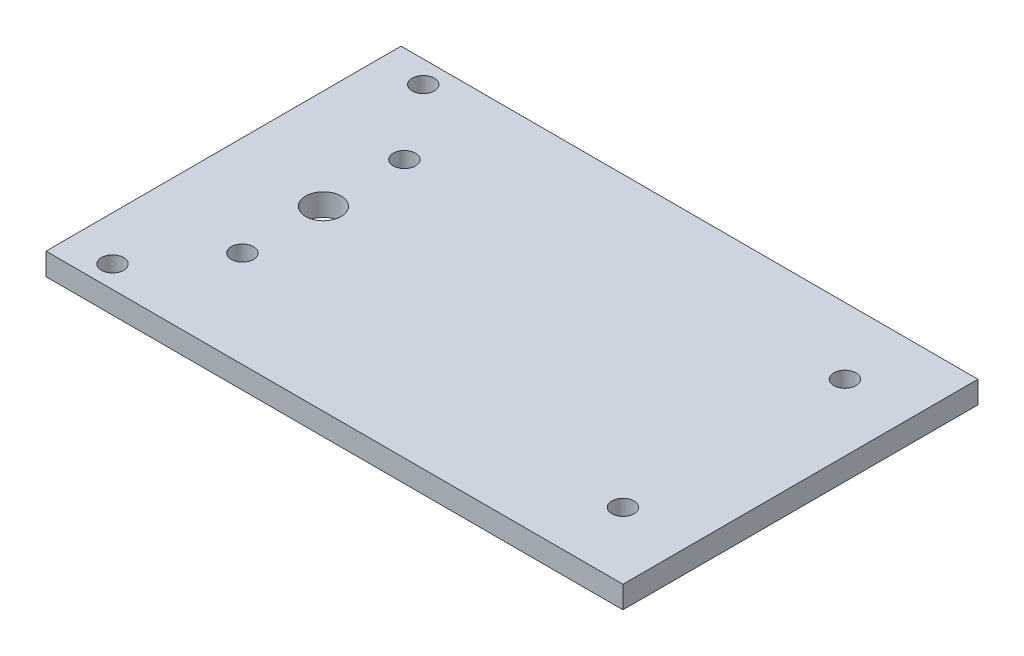
ISO-10303-21;
HEADER;
FILE_DESCRIPTION(('STEP AP214'),'2;1');
FILE_NAME('part.step','',(''),(''),'','','');
FILE_SCHEMA(('AUTOMOTIVE_DESIGN { 1 0 10303 214 1 1 1 1 }'));
ENDSEC;
DATA;
#1=APPLICATION_CONTEXT('core data for automotive mechanical design processes');
#2=APPLICATION_PROTOCOL_DEFINITION('international standard','automotive_design',2000,#1);
#3=PRODUCT_CONTEXT('',#1,'mechanical');
#4=PRODUCT('Part','Part','',(#3));
#5=PRODUCT_RELATED_PRODUCT_CATEGORY('part','',(#4));
#6=PRODUCT_DEFINITION_FORMATION('','',#4);
#7=PRODUCT_DEFINITION_CONTEXT('part definition',#1,'design');
#8=PRODUCT_DEFINITION('design','',#6,#7);
#9=PRODUCT_DEFINITION_SHAPE('','',#8);
#10=(LENGTH_UNIT() NAMED_UNIT(*) SI_UNIT(.MILLI.,.METRE.));
#11=(NAMED_UNIT(*) PLANE_ANGLE_UNIT() SI_UNIT($,.RADIAN.));
#12=(NAMED_UNIT(*) SI_UNIT($,.STERADIAN.) SOLID_ANGLE_UNIT());
#13=UNCERTAINTY_MEASURE_WITH_UNIT(LENGTH_MEASURE(1.E-05),#10,'distance_accuracy_value','');
#14=(GEOMETRIC_REPRESENTATION_CONTEXT(3) GLOBAL_UNCERTAINTY_ASSIGNED_CONTEXT((#13)) GLOBAL_UNIT_ASSIGNED_CONTEXT((#10,
#11,#12)) REPRESENTATION_CONTEXT('',''));
#15=CARTESIAN_POINT('',(0.,0.,0.));
#16=DIRECTION('',(0.,0.,1.));
#17=DIRECTION('',(1.,0.,0.));
#18=AXIS2_PLACEMENT_3D('',#15,#16,#17);
#19=CARTESIAN_POINT('',(0.,5.,0.));
#20=DIRECTION('',(0.,1.,0.));
#21=DIRECTION('',(0.,0.,1.));
#22=AXIS2_PLACEMENT_3D('',#19,#20,#21);
#23=PLANE('',#22);
#24=CARTESIAN_POINT('',(-47.2183098591549,5.,-12.8978873239436));
#25=DIRECTION('',(0.,1.,0.));
#26=DIRECTION('',(0.,0.,1.));
#27=AXIS2_PLACEMENT_3D('',#24,#25,#26);
#28=CIRCLE('',#27,2.5);
#29=CARTESIAN_POINT('',(-47.2183098591549,5.,-10.3978873239436));
#30=VERTEX_POINT('',#29);
#31=EDGE_CURVE('E139',#30,#30,#28,.T.);
#32=ORIENTED_EDGE('',*,*,#31,.F.);
#33=EDGE_LOOP('',(#32));
#34=FACE_BOUND('',#33,.T.);
#35=CARTESIAN_POINT('',(45.2816901408451,5.,30.3521126760564));
#36=DIRECTION('',(0.,1.,0.));
#37=DIRECTION('',(0.,0.,-1.));
#38=AXIS2_PLACEMENT_3D('',#35,#36,#37);
#39=CIRCLE('',#38,2.5);
#40=CARTESIAN_POINT('',(45.2816901408451,5.,27.8521126760563));
#41=VERTEX_POINT('',#40);
#42=EDGE_CURVE('E127',#41,#41,#39,.T.);
#43=ORIENTED_EDGE('',*,*,#42,.F.);
#44=EDGE_LOOP('',(#43));
#45=FACE_BOUND('',#44,.T.);
#46=CARTESIAN_POINT('',(45.2816901408451,5.,-19.6478873239437));
#47=DIRECTION('',(0.,1.,0.));
#48=DIRECTION('',(0.,0.,1.));
#49=AXIS2_PLACEMENT_3D('',#46,#47,#48);
#50=CIRCLE('',#49,2.5);
#51=CARTESIAN_POINT('',(45.2816901408451,5.,-17.1478873239436));
#52=VERTEX_POINT('',#51);
#53=EDGE_CURVE('E115',#52,#52,#50,.T.);
#54=ORIENTED_EDGE('',*,*,#53,.F.);
#55=EDGE_LOOP('',(#54));
#56=FACE_BOUND('',#55,.T.);
#57=DIRECTION('',(0.,0.,1.));
#58=VECTOR('',#57,1.);
#59=CARTESIAN_POINT('',(-69.7183098591549,5.,-34.6478873239436));
#60=LINE('',#59,#58);
#61=CARTESIAN_POINT('',(-69.7183098591549,5.,-34.6478873239436));
#62=VERTEX_POINT('',#61);
#63=CARTESIAN_POINT('',(-69.7183098591549,5.,45.3521126760564));
#64=VERTEX_POINT('',#63);
#65=EDGE_CURVE('E85',#62,#64,#60,.T.);
#66=ORIENTED_EDGE('',*,*,#65,.T.);
#67=DIRECTION('',(1.,0.,0.));
#68=VECTOR('',#67,1.);
#69=CARTESIAN_POINT('',(-69.7183098591549,5.,45.3521126760564));
#70=LINE('',#69,#68);
#71=CARTESIAN_POINT('',(60.2816901408451,5.,45.3521126760564));
#72=VERTEX_POINT('',#71);
#73=EDGE_CURVE('E80',#64,#72,#70,.T.);
#74=ORIENTED_EDGE('',*,*,#73,.T.);
#75=DIRECTION('',(0.,0.,-1.));
#76=VECTOR('',#75,1.);
#77=CARTESIAN_POINT('',(60.2816901408451,5.,-34.6478873239436));
#78=LINE('',#77,#76);
#79=CARTESIAN_POINT('',(60.2816901408451,5.,-34.6478873239436));
#80=VERTEX_POINT('',#79);
#81=EDGE_CURVE('E83',#72,#80,#78,.T.);
#82=ORIENTED_EDGE('',*,*,#81,.T.);
#83=DIRECTION('',(-1.,0.,0.));
#84=VECTOR('',#83,1.);
#85=CARTESIAN_POINT('',(-69.7183098591549,5.,-34.6478873239436));
#86=LINE('',#85,#84);
#87=EDGE_CURVE('E50',#80,#62,#86,.T.);
#88=ORIENTED_EDGE('',*,*,#87,.T.);
#89=EDGE_LOOP('',(#66,#74,#82,#88));
#90=FACE_BOUND('',#89,.T.);
#91=CARTESIAN_POINT('',(-47.2183098591549,5.,5.35211267605635));
#92=DIRECTION('',(0.,1.,0.));
#93=DIRECTION('',(0.,0.,1.));
#94=AXIS2_PLACEMENT_3D('',#91,#92,#93);
#95=CIRCLE('',#94,4.00000000000001);
#96=CARTESIAN_POINT('',(-47.2183098591549,5.,9.35211267605636));
#97=VERTEX_POINT('',#96);
#98=EDGE_CURVE('E100',#97,#97,#95,.T.);
#99=ORIENTED_EDGE('',*,*,#98,.F.);
#100=EDGE_LOOP('',(#99));
#101=FACE_BOUND('',#100,.T.);
#102=CARTESIAN_POINT('',(-59.7183098591549,5.,-29.6478873239436));
#103=DIRECTION('',(0.,1.,0.));
#104=DIRECTION('',(0.,0.,1.));
#105=AXIS2_PLACEMENT_3D('',#102,#103,#104);
#106=CIRCLE('',#105,2.5);
#107=CARTESIAN_POINT('',(-59.7183098591549,5.,-27.1478873239436));
#108=VERTEX_POINT('',#107);
#109=EDGE_CURVE('E121',#108,#108,#106,.T.);
#110=ORIENTED_EDGE('',*,*,#109,.F.);
#111=EDGE_LOOP('',(#110));
#112=FACE_BOUND('',#111,.T.);
#113=CARTESIAN_POINT('',(-59.7183098591549,5.,40.3521126760564));
#114=DIRECTION('',(0.,1.,0.));
#115=DIRECTION('',(0.,0.,-1.));
#116=AXIS2_PLACEMENT_3D('',#113,#114,#115);
#117=CIRCLE('',#116,2.5);
#118=CARTESIAN_POINT('',(-59.7183098591549,5.,37.8521126760564));
#119=VERTEX_POINT('',#118);
#120=EDGE_CURVE('E133',#119,#119,#117,.T.);
#121=ORIENTED_EDGE('',*,*,#120,.F.);
#122=EDGE_LOOP('',(#121));
#123=FACE_BOUND('',#122,.T.);
#124=CARTESIAN_POINT('',(-47.2183098591549,5.,23.6021126760563));
#125=DIRECTION('',(0.,1.,0.));
#126=DIRECTION('',(0.,0.,-1.));
#127=AXIS2_PLACEMENT_3D('',#124,#125,#126);
#128=CIRCLE('',#127,2.5);
#129=CARTESIAN_POINT('',(-47.2183098591549,5.,21.1021126760563));
#130=VERTEX_POINT('',#129);
#131=EDGE_CURVE('E145',#130,#130,#128,.T.);
#132=ORIENTED_EDGE('',*,*,#131,.F.);
#133=EDGE_LOOP('',(#132));
#134=FACE_BOUND('',#133,.T.);
#135=ADVANCED_FACE('F33',(#34,#45,#56,#90,#101,#112,#123,#134),#23,.T.);
#136=CARTESIAN_POINT('',(0.,0.,0.));
#137=DIRECTION('',(0.,1.,0.));
#138=DIRECTION('',(0.,0.,1.));
#139=AXIS2_PLACEMENT_3D('',#136,#137,#138);
#140=PLANE('',#139);
#141=DIRECTION('',(0.,0.,1.));
#142=VECTOR('',#141,1.);
#143=CARTESIAN_POINT('',(-69.7183098591549,0.,-34.6478873239436));
#144=LINE('',#143,#142);
#145=CARTESIAN_POINT('',(-69.7183098591549,0.,-34.6478873239436));
#146=VERTEX_POINT('',#145);
#147=CARTESIAN_POINT('',(-69.7183098591549,0.,45.3521126760564));
#148=VERTEX_POINT('',#147);
#149=EDGE_CURVE('E97',#146,#148,#144,.T.);
#150=ORIENTED_EDGE('',*,*,#149,.F.);
#151=DIRECTION('',(-1.,0.,0.));
#152=VECTOR('',#151,1.);
#153=CARTESIAN_POINT('',(-69.7183098591549,0.,-34.6478873239436));
#154=LINE('',#153,#152);
#155=CARTESIAN_POINT('',(60.2816901408451,0.,-34.6478873239436));
#156=VERTEX_POINT('',#155);
#157=EDGE_CURVE('E73',#156,#146,#154,.T.);
#158=ORIENTED_EDGE('',*,*,#157,.F.);
#159=DIRECTION('',(0.,0.,-1.));
#160=VECTOR('',#159,1.);
#161=CARTESIAN_POINT('',(60.2816901408451,0.,-34.6478873239436));
#162=LINE('',#161,#160);
#163=CARTESIAN_POINT('',(60.2816901408451,0.,45.3521126760564));
#164=VERTEX_POINT('',#163);
#165=EDGE_CURVE('E67',#164,#156,#162,.T.);
#166=ORIENTED_EDGE('',*,*,#165,.F.);
#167=DIRECTION('',(1.,0.,0.));
#168=VECTOR('',#167,1.);
#169=CARTESIAN_POINT('',(-69.7183098591549,0.,45.3521126760564));
#170=LINE('',#169,#168);
#171=EDGE_CURVE('E89',#148,#164,#170,.T.);
#172=ORIENTED_EDGE('',*,*,#171,.F.);
#173=EDGE_LOOP('',(#150,#158,#166,#172));
#174=FACE_BOUND('',#173,.T.);
#175=CARTESIAN_POINT('',(-47.2183098591549,0.,5.35211267605635));
#176=DIRECTION('',(0.,1.,0.));
#177=DIRECTION('',(0.,0.,1.));
#178=AXIS2_PLACEMENT_3D('',#175,#176,#177);
#179=CIRCLE('',#178,4.00000000000001);
#180=CARTESIAN_POINT('',(-47.2183098591549,0.,9.35211267605636));
#181=VERTEX_POINT('',#180);
#182=EDGE_CURVE('E112',#181,#181,#179,.T.);
#183=ORIENTED_EDGE('',*,*,#182,.T.);
#184=EDGE_LOOP('',(#183));
#185=FACE_BOUND('',#184,.T.);
#186=CARTESIAN_POINT('',(45.2816901408451,0.,-19.6478873239437));
#187=DIRECTION('',(0.,1.,0.));
#188=DIRECTION('',(0.,0.,1.));
#189=AXIS2_PLACEMENT_3D('',#186,#187,#188);
#190=CIRCLE('',#189,2.5);
#191=CARTESIAN_POINT('',(45.2816901408451,0.,-17.1478873239436));
#192=VERTEX_POINT('',#191);
#193=EDGE_CURVE('E118',#192,#192,#190,.T.);
#194=ORIENTED_EDGE('',*,*,#193,.T.);
#195=EDGE_LOOP('',(#194));
#196=FACE_BOUND('',#195,.T.);
#197=CARTESIAN_POINT('',(-59.7183098591549,0.,-29.6478873239436));
#198=DIRECTION('',(0.,1.,0.));
#199=DIRECTION('',(0.,0.,1.));
#200=AXIS2_PLACEMENT_3D('',#197,#198,#199);
#201=CIRCLE('',#200,2.5);
#202=CARTESIAN_POINT('',(-59.7183098591549,0.,-27.1478873239436));
#203=VERTEX_POINT('',#202);
#204=EDGE_CURVE('E124',#203,#203,#201,.T.);
#205=ORIENTED_EDGE('',*,*,#204,.T.);
#206=EDGE_LOOP('',(#205));
#207=FACE_BOUND('',#206,.T.);
#208=CARTESIAN_POINT('',(45.2816901408451,0.,30.3521126760564));
#209=DIRECTION('',(0.,1.,0.));
#210=DIRECTION('',(0.,0.,-1.));
#211=AXIS2_PLACEMENT_3D('',#208,#209,#210);
#212=CIRCLE('',#211,2.5);
#213=CARTESIAN_POINT('',(45.2816901408451,0.,27.8521126760563));
#214=VERTEX_POINT('',#213);
#215=EDGE_CURVE('E130',#214,#214,#212,.T.);
#216=ORIENTED_EDGE('',*,*,#215,.T.);
#217=EDGE_LOOP('',(#216));
#218=FACE_BOUND('',#217,.T.);
#219=CARTESIAN_POINT('',(-59.7183098591549,0.,40.3521126760564));
#220=DIRECTION('',(0.,1.,0.));
#221=DIRECTION('',(0.,0.,-1.));
#222=AXIS2_PLACEMENT_3D('',#219,#220,#221);
#223=CIRCLE('',#222,2.5);
#224=CARTESIAN_POINT('',(-59.7183098591549,0.,37.8521126760564));
#225=VERTEX_POINT('',#224);
#226=EDGE_CURVE('E136',#225,#225,#223,.T.);
#227=ORIENTED_EDGE('',*,*,#226,.T.);
#228=EDGE_LOOP('',(#227));
#229=FACE_BOUND('',#228,.T.);
#230=CARTESIAN_POINT('',(-47.2183098591549,0.,-12.8978873239436));
#231=DIRECTION('',(0.,1.,0.));
#232=DIRECTION('',(0.,0.,1.));
#233=AXIS2_PLACEMENT_3D('',#230,#231,#232);
#234=CIRCLE('',#233,2.5);
#235=CARTESIAN_POINT('',(-47.2183098591549,0.,-10.3978873239436));
#236=VERTEX_POINT('',#235);
#237=EDGE_CURVE('E142',#236,#236,#234,.T.);
#238=ORIENTED_EDGE('',*,*,#237,.T.);
#239=EDGE_LOOP('',(#238));
#240=FACE_BOUND('',#239,.T.);
#241=CARTESIAN_POINT('',(-47.2183098591549,0.,23.6021126760563));
#242=DIRECTION('',(0.,1.,0.));
#243=DIRECTION('',(0.,0.,-1.));
#244=AXIS2_PLACEMENT_3D('',#241,#242,#243);
#245=CIRCLE('',#244,2.5);
#246=CARTESIAN_POINT('',(-47.2183098591549,0.,21.1021126760563));
#247=VERTEX_POINT('',#246);
#248=EDGE_CURVE('E148',#247,#247,#245,.T.);
#249=ORIENTED_EDGE('',*,*,#248,.T.);
#250=EDGE_LOOP('',(#249));
#251=FACE_BOUND('',#250,.T.);
#252=ADVANCED_FACE('F108',(#174,#185,#196,#207,#218,#229,#240,#251),#140,.F.);
#253=CARTESIAN_POINT('',(-69.7183098591549,5.,-34.6478873239436));
#254=DIRECTION('',(1.,0.,0.));
#255=DIRECTION('',(0.,0.,-1.));
#256=AXIS2_PLACEMENT_3D('',#253,#254,#255);
#257=PLANE('',#256);
#258=ORIENTED_EDGE('',*,*,#149,.T.);
#259=DIRECTION('',(0.,-1.,0.));
#260=VECTOR('',#259,1.);
#261=CARTESIAN_POINT('',(-69.7183098591549,5.,45.3521126760564));
#262=LINE('',#261,#260);
#263=EDGE_CURVE('E11',#64,#148,#262,.T.);
#264=ORIENTED_EDGE('',*,*,#263,.F.);
#265=ORIENTED_EDGE('',*,*,#65,.F.);
#266=DIRECTION('',(0.,-1.,0.));
#267=VECTOR('',#266,1.);
#268=CARTESIAN_POINT('',(-69.7183098591549,5.,-34.6478873239436));
#269=LINE('',#268,#267);
#270=EDGE_CURVE('E93',#62,#146,#269,.T.);
#271=ORIENTED_EDGE('',*,*,#270,.T.);
#272=EDGE_LOOP('',(#258,#264,#265,#271));
#273=FACE_BOUND('',#272,.T.);
#274=ADVANCED_FACE('F35',(#273),#257,.F.);
#275=CARTESIAN_POINT('',(-69.7183098591549,5.,45.3521126760564));
#276=DIRECTION('',(0.,0.,-1.));
#277=DIRECTION('',(-1.,0.,0.));
#278=AXIS2_PLACEMENT_3D('',#275,#276,#277);
#279=PLANE('',#278);
#280=ORIENTED_EDGE('',*,*,#171,.T.);
#281=DIRECTION('',(0.,-1.,0.));
#282=VECTOR('',#281,1.);
#283=CARTESIAN_POINT('',(60.2816901408451,5.,45.3521126760564));
#284=LINE('',#283,#282);
#285=EDGE_CURVE('E42',#72,#164,#284,.T.);
#286=ORIENTED_EDGE('',*,*,#285,.F.);
#287=ORIENTED_EDGE('',*,*,#73,.F.);
#288=ORIENTED_EDGE('',*,*,#263,.T.);
#289=EDGE_LOOP('',(#280,#286,#287,#288));
#290=FACE_BOUND('',#289,.T.);
#291=ADVANCED_FACE('F88',(#290),#279,.F.);
#292=CARTESIAN_POINT('',(60.2816901408451,5.,-34.6478873239436));
#293=DIRECTION('',(-1.,0.,0.));
#294=DIRECTION('',(0.,0.,1.));
#295=AXIS2_PLACEMENT_3D('',#292,#293,#294);
#296=PLANE('',#295);
#297=ORIENTED_EDGE('',*,*,#165,.T.);
#298=DIRECTION('',(0.,-1.,0.));
#299=VECTOR('',#298,1.);
#300=CARTESIAN_POINT('',(60.2816901408451,5.,-34.6478873239436));
#301=LINE('',#300,#299);
#302=EDGE_CURVE('E90',#80,#156,#301,.T.);
#303=ORIENTED_EDGE('',*,*,#302,.F.);
#304=ORIENTED_EDGE('',*,*,#81,.F.);
#305=ORIENTED_EDGE('',*,*,#285,.T.);
#306=EDGE_LOOP('',(#297,#303,#304,#305));
#307=FACE_BOUND('',#306,.T.);
#308=ADVANCED_FACE('F91',(#307),#296,.F.);
#309=CARTESIAN_POINT('',(-69.7183098591549,5.,-34.6478873239436));
#310=DIRECTION('',(0.,0.,1.));
#311=DIRECTION('',(1.,0.,0.));
#312=AXIS2_PLACEMENT_3D('',#309,#310,#311);
#313=PLANE('',#312);
#314=ORIENTED_EDGE('',*,*,#157,.T.);
#315=ORIENTED_EDGE('',*,*,#270,.F.);
#316=ORIENTED_EDGE('',*,*,#87,.F.);
#317=ORIENTED_EDGE('',*,*,#302,.T.);
#318=EDGE_LOOP('',(#314,#315,#316,#317));
#319=FACE_BOUND('',#318,.T.);
#320=ADVANCED_FACE('F105',(#319),#313,.F.);
#321=CARTESIAN_POINT('',(-47.2183098591549,5.,5.35211267605635));
#322=DIRECTION('',(0.,-1.,0.));
#323=DIRECTION('',(0.,0.,-1.));
#324=AXIS2_PLACEMENT_3D('',#321,#322,#323);
#325=CYLINDRICAL_SURFACE('',#324,4.00000000000001);
#326=ORIENTED_EDGE('',*,*,#98,.T.);
#327=EDGE_LOOP('',(#326));
#328=FACE_BOUND('',#327,.T.);
#329=ORIENTED_EDGE('',*,*,#182,.F.);
#330=EDGE_LOOP('',(#329));
#331=FACE_BOUND('',#330,.T.);
#332=ADVANCED_FACE('F167',(#328,#331),#325,.F.);
#333=CARTESIAN_POINT('',(45.2816901408451,5.,-19.6478873239437));
#334=DIRECTION('',(0.,-1.,0.));
#335=DIRECTION('',(0.,0.,-1.));
#336=AXIS2_PLACEMENT_3D('',#333,#334,#335);
#337=CYLINDRICAL_SURFACE('',#336,2.5);
#338=ORIENTED_EDGE('',*,*,#53,.T.);
#339=EDGE_LOOP('',(#338));
#340=FACE_BOUND('',#339,.T.);
#341=ORIENTED_EDGE('',*,*,#193,.F.);
#342=EDGE_LOOP('',(#341));
#343=FACE_BOUND('',#342,.T.);
#344=ADVANCED_FACE('F213',(#340,#343),#337,.F.);
#345=CARTESIAN_POINT('',(-59.7183098591549,5.,-29.6478873239436));
#346=DIRECTION('',(0.,-1.,0.));
#347=DIRECTION('',(0.,0.,-1.));
#348=AXIS2_PLACEMENT_3D('',#345,#346,#347);
#349=CYLINDRICAL_SURFACE('',#348,2.5);
#350=ORIENTED_EDGE('',*,*,#109,.T.);
#351=EDGE_LOOP('',(#350));
#352=FACE_BOUND('',#351,.T.);
#353=ORIENTED_EDGE('',*,*,#204,.F.);
#354=EDGE_LOOP('',(#353));
#355=FACE_BOUND('',#354,.T.);
#356=ADVANCED_FACE('F221',(#352,#355),#349,.F.);
#357=CARTESIAN_POINT('',(45.2816901408451,5.,30.3521126760564));
#358=DIRECTION('',(0.,-1.,0.));
#359=DIRECTION('',(0.,0.,-1.));
#360=AXIS2_PLACEMENT_3D('',#357,#358,#359);
#361=CYLINDRICAL_SURFACE('',#360,2.5);
#362=ORIENTED_EDGE('',*,*,#42,.T.);
#363=EDGE_LOOP('',(#362));
#364=FACE_BOUND('',#363,.T.);
#365=ORIENTED_EDGE('',*,*,#215,.F.);
#366=EDGE_LOOP('',(#365));
#367=FACE_BOUND('',#366,.T.);
#368=ADVANCED_FACE('F229',(#364,#367),#361,.F.);
#369=CARTESIAN_POINT('',(-59.7183098591549,5.,40.3521126760564));
#370=DIRECTION('',(0.,-1.,0.));
#371=DIRECTION('',(0.,0.,-1.));
#372=AXIS2_PLACEMENT_3D('',#369,#370,#371);
#373=CYLINDRICAL_SURFACE('',#372,2.5);
#374=ORIENTED_EDGE('',*,*,#120,.T.);
#375=EDGE_LOOP('',(#374));
#376=FACE_BOUND('',#375,.T.);
#377=ORIENTED_EDGE('',*,*,#226,.F.);
#378=EDGE_LOOP('',(#377));
#379=FACE_BOUND('',#378,.T.);
#380=ADVANCED_FACE('F238',(#376,#379),#373,.F.);
#381=CARTESIAN_POINT('',(-47.2183098591549,5.,-12.8978873239436));
#382=DIRECTION('',(0.,-1.,0.));
#383=DIRECTION('',(0.,0.,-1.));
#384=AXIS2_PLACEMENT_3D('',#381,#382,#383);
#385=CYLINDRICAL_SURFACE('',#384,2.5);
#386=ORIENTED_EDGE('',*,*,#31,.T.);
#387=EDGE_LOOP('',(#386));
#388=FACE_BOUND('',#387,.T.);
#389=ORIENTED_EDGE('',*,*,#237,.F.);
#390=EDGE_LOOP('',(#389));
#391=FACE_BOUND('',#390,.T.);
#392=ADVANCED_FACE('F247',(#388,#391),#385,.F.);
#393=CARTESIAN_POINT('',(-47.2183098591549,5.,23.6021126760563));
#394=DIRECTION('',(0.,-1.,0.));
#395=DIRECTION('',(0.,0.,-1.));
#396=AXIS2_PLACEMENT_3D('',#393,#394,#395);
#397=CYLINDRICAL_SURFACE('',#396,2.5);
#398=ORIENTED_EDGE('',*,*,#131,.T.);
#399=EDGE_LOOP('',(#398));
#400=FACE_BOUND('',#399,.T.);
#401=ORIENTED_EDGE('',*,*,#248,.F.);
#402=EDGE_LOOP('',(#401));
#403=FACE_BOUND('',#402,.T.);
#404=ADVANCED_FACE('F154',(#400,#403),#397,.F.);
#405=CLOSED_SHELL('',(#135,#252,#274,#291,#308,#320,#332,#344,#356,#368,#380,#392,#404));
#406=MANIFOLD_SOLID_BREP('B2',#405);
#407=ADVANCED_BREP_SHAPE_REPRESENTATION('',(#18,#406),#14);
#408=SHAPE_DEFINITION_REPRESENTATION(#9,#407);
ENDSEC;
END-ISO-10303-21;
